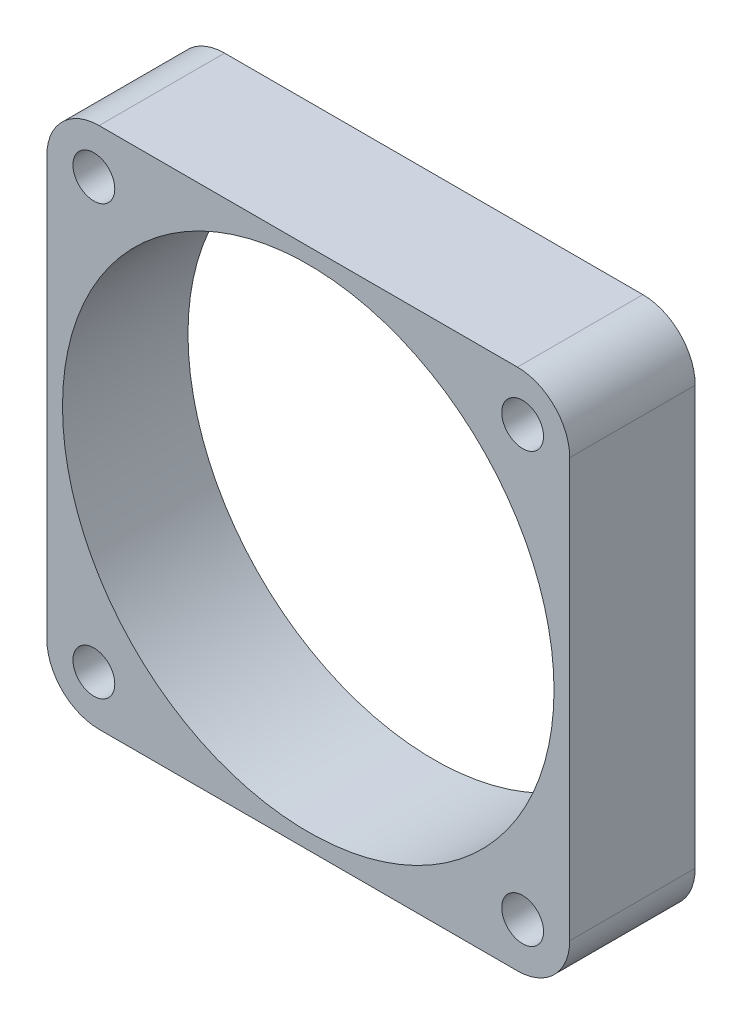
ISO-10303-21;
HEADER;
FILE_DESCRIPTION(('STEP AP214'),'2;1');
FILE_NAME('part.step','',(''),(''),'','','');
FILE_SCHEMA(('AUTOMOTIVE_DESIGN { 1 0 10303 214 1 1 1 1 }'));
ENDSEC;
DATA;
#1=APPLICATION_CONTEXT('core data for automotive mechanical design processes');
#2=APPLICATION_PROTOCOL_DEFINITION('international standard','automotive_design',2000,#1);
#3=PRODUCT_CONTEXT('',#1,'mechanical');
#4=PRODUCT('Part','Part','',(#3));
#5=PRODUCT_RELATED_PRODUCT_CATEGORY('part','',(#4));
#6=PRODUCT_DEFINITION_FORMATION('','',#4);
#7=PRODUCT_DEFINITION_CONTEXT('part definition',#1,'design');
#8=PRODUCT_DEFINITION('design','',#6,#7);
#9=PRODUCT_DEFINITION_SHAPE('','',#8);
#10=(LENGTH_UNIT() NAMED_UNIT(*) SI_UNIT(.MILLI.,.METRE.));
#11=(NAMED_UNIT(*) PLANE_ANGLE_UNIT() SI_UNIT($,.RADIAN.));
#12=(NAMED_UNIT(*) SI_UNIT($,.STERADIAN.) SOLID_ANGLE_UNIT());
#13=UNCERTAINTY_MEASURE_WITH_UNIT(LENGTH_MEASURE(1.E-05),#10,'distance_accuracy_value','');
#14=(GEOMETRIC_REPRESENTATION_CONTEXT(3) GLOBAL_UNCERTAINTY_ASSIGNED_CONTEXT((#13)) GLOBAL_UNIT_ASSIGNED_CONTEXT((#10,
#11,#12)) REPRESENTATION_CONTEXT('',''));
#15=CARTESIAN_POINT('',(0.,0.,0.));
#16=DIRECTION('',(0.,0.,1.));
#17=DIRECTION('',(1.,0.,0.));
#18=AXIS2_PLACEMENT_3D('',#15,#16,#17);
#19=CARTESIAN_POINT('',(0.,0.,12.));
#20=DIRECTION('',(0.,0.,1.));
#21=DIRECTION('',(1.,0.,0.));
#22=AXIS2_PLACEMENT_3D('',#19,#20,#21);
#23=PLANE('',#22);
#24=CARTESIAN_POINT('',(-46.7061885100436,1.63349551630329,12.));
#25=DIRECTION('',(0.,0.,1.));
#26=DIRECTION('',(1.,0.,0.));
#27=AXIS2_PLACEMENT_3D('',#24,#25,#26);
#28=CIRCLE('',#27,2.);
#29=CARTESIAN_POINT('',(-44.7061885100436,1.63349551630329,12.));
#30=VERTEX_POINT('',#29);
#31=EDGE_CURVE('E188',#30,#30,#28,.T.);
#32=ORIENTED_EDGE('',*,*,#31,.F.);
#33=EDGE_LOOP('',(#32));
#34=FACE_BOUND('',#33,.T.);
#35=CARTESIAN_POINT('',(-5.70618851004357,-39.3665044836967,12.));
#36=DIRECTION('',(0.,0.,1.));
#37=DIRECTION('',(1.,0.,0.));
#38=AXIS2_PLACEMENT_3D('',#35,#36,#37);
#39=CIRCLE('',#38,2.);
#40=CARTESIAN_POINT('',(-3.70618851004357,-39.3665044836967,12.));
#41=VERTEX_POINT('',#40);
#42=EDGE_CURVE('E177',#41,#41,#39,.T.);
#43=ORIENTED_EDGE('',*,*,#42,.F.);
#44=EDGE_LOOP('',(#43));
#45=FACE_BOUND('',#44,.T.);
#46=DIRECTION('',(0.,1.,0.));
#47=VECTOR('',#46,1.);
#48=CARTESIAN_POINT('',(-1.20618851004357,6.13349551630329,12.));
#49=LINE('',#48,#47);
#50=CARTESIAN_POINT('',(-1.20618851004357,-38.8665044836967,12.));
#51=VERTEX_POINT('',#50);
#52=CARTESIAN_POINT('',(-1.20618851004357,1.13349551630329,12.));
#53=VERTEX_POINT('',#52);
#54=EDGE_CURVE('E172',#51,#53,#49,.T.);
#55=ORIENTED_EDGE('',*,*,#54,.T.);
#56=CARTESIAN_POINT('',(-6.20618851004357,1.13349551630328,12.));
#57=DIRECTION('',(0.,0.,1.));
#58=DIRECTION('',(1.,0.,0.));
#59=AXIS2_PLACEMENT_3D('',#56,#57,#58);
#60=CIRCLE('',#59,5.);
#61=CARTESIAN_POINT('',(-6.20618851004357,6.13349551630329,12.));
#62=VERTEX_POINT('',#61);
#63=EDGE_CURVE('E149',#53,#62,#60,.T.);
#64=ORIENTED_EDGE('',*,*,#63,.T.);
#65=DIRECTION('',(-1.,0.,0.));
#66=VECTOR('',#65,1.);
#67=CARTESIAN_POINT('',(-51.2061885100436,6.13349551630329,12.));
#68=LINE('',#67,#66);
#69=CARTESIAN_POINT('',(-46.2061885100436,6.13349551630329,12.));
#70=VERTEX_POINT('',#69);
#71=EDGE_CURVE('E120',#62,#70,#68,.T.);
#72=ORIENTED_EDGE('',*,*,#71,.T.);
#73=CARTESIAN_POINT('',(-46.2061885100436,1.13349551630328,12.));
#74=DIRECTION('',(0.,0.,1.));
#75=DIRECTION('',(1.,0.,0.));
#76=AXIS2_PLACEMENT_3D('',#73,#74,#75);
#77=CIRCLE('',#76,5.);
#78=CARTESIAN_POINT('',(-51.2061885100436,1.13349551630328,12.));
#79=VERTEX_POINT('',#78);
#80=EDGE_CURVE('E147',#70,#79,#77,.T.);
#81=ORIENTED_EDGE('',*,*,#80,.T.);
#82=DIRECTION('',(0.,-1.,0.));
#83=VECTOR('',#82,1.);
#84=CARTESIAN_POINT('',(-51.2061885100436,6.13349551630329,12.));
#85=LINE('',#84,#83);
#86=CARTESIAN_POINT('',(-51.2061885100436,-38.8665044836967,12.));
#87=VERTEX_POINT('',#86);
#88=EDGE_CURVE('E127',#79,#87,#85,.T.);
#89=ORIENTED_EDGE('',*,*,#88,.T.);
#90=CARTESIAN_POINT('',(-46.2061885100436,-38.8665044836967,12.));
#91=DIRECTION('',(0.,0.,1.));
#92=DIRECTION('',(1.,0.,0.));
#93=AXIS2_PLACEMENT_3D('',#90,#91,#92);
#94=CIRCLE('',#93,5.);
#95=CARTESIAN_POINT('',(-46.2061885100436,-43.8665044836967,12.));
#96=VERTEX_POINT('',#95);
#97=EDGE_CURVE('E55',#87,#96,#94,.T.);
#98=ORIENTED_EDGE('',*,*,#97,.T.);
#99=DIRECTION('',(1.,0.,0.));
#100=VECTOR('',#99,1.);
#101=CARTESIAN_POINT('',(-51.2061885100436,-43.8665044836967,12.));
#102=LINE('',#101,#100);
#103=CARTESIAN_POINT('',(-6.20618851004357,-43.8665044836967,12.));
#104=VERTEX_POINT('',#103);
#105=EDGE_CURVE('E130',#96,#104,#102,.T.);
#106=ORIENTED_EDGE('',*,*,#105,.T.);
#107=CARTESIAN_POINT('',(-6.20618851004357,-38.8665044836967,12.));
#108=DIRECTION('',(0.,0.,1.));
#109=DIRECTION('',(1.,0.,0.));
#110=AXIS2_PLACEMENT_3D('',#107,#108,#109);
#111=CIRCLE('',#110,5.);
#112=EDGE_CURVE('E144',#104,#51,#111,.T.);
#113=ORIENTED_EDGE('',*,*,#112,.T.);
#114=EDGE_LOOP('',(#55,#64,#72,#81,#89,#98,#106,#113));
#115=FACE_BOUND('',#114,.T.);
#116=CARTESIAN_POINT('',(-46.7061885100436,-39.3665044836967,12.));
#117=DIRECTION('',(0.,0.,1.));
#118=DIRECTION('',(1.,0.,0.));
#119=AXIS2_PLACEMENT_3D('',#116,#117,#118);
#120=CIRCLE('',#119,2.);
#121=CARTESIAN_POINT('',(-44.7061885100436,-39.3665044836967,12.));
#122=VERTEX_POINT('',#121);
#123=EDGE_CURVE('E165',#122,#122,#120,.T.);
#124=ORIENTED_EDGE('',*,*,#123,.F.);
#125=EDGE_LOOP('',(#124));
#126=FACE_BOUND('',#125,.T.);
#127=CARTESIAN_POINT('',(-5.70618851004357,1.63349551630329,12.));
#128=DIRECTION('',(0.,0.,1.));
#129=DIRECTION('',(1.,0.,0.));
#130=AXIS2_PLACEMENT_3D('',#127,#128,#129);
#131=CIRCLE('',#130,2.);
#132=CARTESIAN_POINT('',(-3.70618851004357,1.63349551630329,12.));
#133=VERTEX_POINT('',#132);
#134=EDGE_CURVE('E182',#133,#133,#131,.T.);
#135=ORIENTED_EDGE('',*,*,#134,.F.);
#136=EDGE_LOOP('',(#135));
#137=FACE_BOUND('',#136,.T.);
#138=CARTESIAN_POINT('',(-26.2061885100436,-18.8665044836967,12.));
#139=DIRECTION('',(0.,0.,1.));
#140=DIRECTION('',(1.,0.,0.));
#141=AXIS2_PLACEMENT_3D('',#138,#139,#140);
#142=CIRCLE('',#141,23.5);
#143=CARTESIAN_POINT('',(-2.70618851004357,-18.8665044836967,12.));
#144=VERTEX_POINT('',#143);
#145=EDGE_CURVE('E194',#144,#144,#142,.T.);
#146=ORIENTED_EDGE('',*,*,#145,.F.);
#147=EDGE_LOOP('',(#146));
#148=FACE_BOUND('',#147,.T.);
#149=ADVANCED_FACE('F34',(#34,#45,#115,#126,#137,#148),#23,.T.);
#150=CARTESIAN_POINT('',(0.,0.,0.));
#151=DIRECTION('',(0.,0.,1.));
#152=DIRECTION('',(1.,0.,0.));
#153=AXIS2_PLACEMENT_3D('',#150,#151,#152);
#154=PLANE('',#153);
#155=DIRECTION('',(-1.,0.,0.));
#156=VECTOR('',#155,1.);
#157=CARTESIAN_POINT('',(-51.2061885100436,6.13349551630329,0.));
#158=LINE('',#157,#156);
#159=CARTESIAN_POINT('',(-6.20618851004357,6.13349551630329,0.));
#160=VERTEX_POINT('',#159);
#161=CARTESIAN_POINT('',(-46.2061885100436,6.13349551630329,0.));
#162=VERTEX_POINT('',#161);
#163=EDGE_CURVE('E117',#160,#162,#158,.T.);
#164=ORIENTED_EDGE('',*,*,#163,.F.);
#165=CARTESIAN_POINT('',(-6.20618851004357,1.13349551630328,0.));
#166=DIRECTION('',(0.,0.,1.));
#167=DIRECTION('',(1.,0.,0.));
#168=AXIS2_PLACEMENT_3D('',#165,#166,#167);
#169=CIRCLE('',#168,5.);
#170=CARTESIAN_POINT('',(-1.20618851004357,1.13349551630329,0.));
#171=VERTEX_POINT('',#170);
#172=EDGE_CURVE('E100',#160,#171,#169,.F.);
#173=ORIENTED_EDGE('',*,*,#172,.T.);
#174=DIRECTION('',(0.,1.,0.));
#175=VECTOR('',#174,1.);
#176=CARTESIAN_POINT('',(-1.20618851004357,6.13349551630329,0.));
#177=LINE('',#176,#175);
#178=CARTESIAN_POINT('',(-1.20618851004357,-38.8665044836967,0.));
#179=VERTEX_POINT('',#178);
#180=EDGE_CURVE('E128',#179,#171,#177,.T.);
#181=ORIENTED_EDGE('',*,*,#180,.F.);
#182=CARTESIAN_POINT('',(-6.20618851004357,-38.8665044836967,0.));
#183=DIRECTION('',(0.,0.,1.));
#184=DIRECTION('',(1.,0.,0.));
#185=AXIS2_PLACEMENT_3D('',#182,#183,#184);
#186=CIRCLE('',#185,5.);
#187=CARTESIAN_POINT('',(-6.20618851004357,-43.8665044836967,0.));
#188=VERTEX_POINT('',#187);
#189=EDGE_CURVE('E121',#179,#188,#186,.F.);
#190=ORIENTED_EDGE('',*,*,#189,.T.);
#191=DIRECTION('',(1.,0.,0.));
#192=VECTOR('',#191,1.);
#193=CARTESIAN_POINT('',(-51.2061885100436,-43.8665044836967,0.));
#194=LINE('',#193,#192);
#195=CARTESIAN_POINT('',(-46.2061885100436,-43.8665044836967,0.));
#196=VERTEX_POINT('',#195);
#197=EDGE_CURVE('E132',#196,#188,#194,.T.);
#198=ORIENTED_EDGE('',*,*,#197,.F.);
#199=CARTESIAN_POINT('',(-46.2061885100436,-38.8665044836967,0.));
#200=DIRECTION('',(0.,0.,1.));
#201=DIRECTION('',(1.,0.,0.));
#202=AXIS2_PLACEMENT_3D('',#199,#200,#201);
#203=CIRCLE('',#202,5.);
#204=CARTESIAN_POINT('',(-51.2061885100436,-38.8665044836967,0.));
#205=VERTEX_POINT('',#204);
#206=EDGE_CURVE('E138',#196,#205,#203,.F.);
#207=ORIENTED_EDGE('',*,*,#206,.T.);
#208=DIRECTION('',(0.,-1.,0.));
#209=VECTOR('',#208,1.);
#210=CARTESIAN_POINT('',(-51.2061885100436,6.13349551630329,0.));
#211=LINE('',#210,#209);
#212=CARTESIAN_POINT('',(-51.2061885100436,1.13349551630328,0.));
#213=VERTEX_POINT('',#212);
#214=EDGE_CURVE('E160',#213,#205,#211,.T.);
#215=ORIENTED_EDGE('',*,*,#214,.F.);
#216=CARTESIAN_POINT('',(-46.2061885100436,1.13349551630328,0.));
#217=DIRECTION('',(0.,0.,1.));
#218=DIRECTION('',(1.,0.,0.));
#219=AXIS2_PLACEMENT_3D('',#216,#217,#218);
#220=CIRCLE('',#219,5.);
#221=EDGE_CURVE('E111',#213,#162,#220,.F.);
#222=ORIENTED_EDGE('',*,*,#221,.T.);
#223=EDGE_LOOP('',(#164,#173,#181,#190,#198,#207,#215,#222));
#224=FACE_BOUND('',#223,.T.);
#225=CARTESIAN_POINT('',(-46.7061885100436,-39.3665044836967,0.));
#226=DIRECTION('',(0.,0.,1.));
#227=DIRECTION('',(1.,0.,0.));
#228=AXIS2_PLACEMENT_3D('',#225,#226,#227);
#229=CIRCLE('',#228,2.);
#230=CARTESIAN_POINT('',(-44.7061885100436,-39.3665044836967,0.));
#231=VERTEX_POINT('',#230);
#232=EDGE_CURVE('E168',#231,#231,#229,.T.);
#233=ORIENTED_EDGE('',*,*,#232,.T.);
#234=EDGE_LOOP('',(#233));
#235=FACE_BOUND('',#234,.T.);
#236=CARTESIAN_POINT('',(-5.70618851004357,-39.3665044836967,0.));
#237=DIRECTION('',(0.,0.,1.));
#238=DIRECTION('',(1.,0.,0.));
#239=AXIS2_PLACEMENT_3D('',#236,#237,#238);
#240=CIRCLE('',#239,2.);
#241=CARTESIAN_POINT('',(-3.70618851004357,-39.3665044836967,0.));
#242=VERTEX_POINT('',#241);
#243=EDGE_CURVE('E179',#242,#242,#240,.T.);
#244=ORIENTED_EDGE('',*,*,#243,.T.);
#245=EDGE_LOOP('',(#244));
#246=FACE_BOUND('',#245,.T.);
#247=CARTESIAN_POINT('',(-5.70618851004357,1.63349551630329,0.));
#248=DIRECTION('',(0.,0.,1.));
#249=DIRECTION('',(1.,0.,0.));
#250=AXIS2_PLACEMENT_3D('',#247,#248,#249);
#251=CIRCLE('',#250,2.);
#252=CARTESIAN_POINT('',(-3.70618851004357,1.63349551630329,0.));
#253=VERTEX_POINT('',#252);
#254=EDGE_CURVE('E185',#253,#253,#251,.T.);
#255=ORIENTED_EDGE('',*,*,#254,.T.);
#256=EDGE_LOOP('',(#255));
#257=FACE_BOUND('',#256,.T.);
#258=CARTESIAN_POINT('',(-46.7061885100436,1.63349551630329,0.));
#259=DIRECTION('',(0.,0.,1.));
#260=DIRECTION('',(1.,0.,0.));
#261=AXIS2_PLACEMENT_3D('',#258,#259,#260);
#262=CIRCLE('',#261,2.);
#263=CARTESIAN_POINT('',(-44.7061885100436,1.63349551630329,0.));
#264=VERTEX_POINT('',#263);
#265=EDGE_CURVE('E191',#264,#264,#262,.T.);
#266=ORIENTED_EDGE('',*,*,#265,.T.);
#267=EDGE_LOOP('',(#266));
#268=FACE_BOUND('',#267,.T.);
#269=CARTESIAN_POINT('',(-26.2061885100436,-18.8665044836967,0.));
#270=DIRECTION('',(0.,0.,1.));
#271=DIRECTION('',(1.,0.,0.));
#272=AXIS2_PLACEMENT_3D('',#269,#270,#271);
#273=CIRCLE('',#272,23.5);
#274=CARTESIAN_POINT('',(-2.70618851004357,-18.8665044836967,0.));
#275=VERTEX_POINT('',#274);
#276=EDGE_CURVE('E197',#275,#275,#273,.T.);
#277=ORIENTED_EDGE('',*,*,#276,.T.);
#278=EDGE_LOOP('',(#277));
#279=FACE_BOUND('',#278,.T.);
#280=ADVANCED_FACE('F124',(#224,#235,#246,#257,#268,#279),#154,.F.);
#281=CARTESIAN_POINT('',(-51.2061885100436,6.13349551630329,12.));
#282=DIRECTION('',(1.,0.,0.));
#283=DIRECTION('',(0.,1.,0.));
#284=AXIS2_PLACEMENT_3D('',#281,#282,#283);
#285=PLANE('',#284);
#286=ORIENTED_EDGE('',*,*,#88,.F.);
#287=DIRECTION('',(0.,0.,-1.));
#288=VECTOR('',#287,1.);
#289=CARTESIAN_POINT('',(-51.2061885100436,1.13349551630328,12.));
#290=LINE('',#289,#288);
#291=EDGE_CURVE('E153',#79,#213,#290,.T.);
#292=ORIENTED_EDGE('',*,*,#291,.T.);
#293=ORIENTED_EDGE('',*,*,#214,.T.);
#294=DIRECTION('',(0.,0.,-1.));
#295=VECTOR('',#294,1.);
#296=CARTESIAN_POINT('',(-51.2061885100436,-38.8665044836967,12.));
#297=LINE('',#296,#295);
#298=EDGE_CURVE('E151',#205,#87,#297,.F.);
#299=ORIENTED_EDGE('',*,*,#298,.T.);
#300=EDGE_LOOP('',(#286,#292,#293,#299));
#301=FACE_BOUND('',#300,.T.);
#302=ADVANCED_FACE('F159',(#301),#285,.F.);
#303=CARTESIAN_POINT('',(-51.2061885100436,-43.8665044836967,12.));
#304=DIRECTION('',(0.,1.,0.));
#305=DIRECTION('',(0.,0.,1.));
#306=AXIS2_PLACEMENT_3D('',#303,#304,#305);
#307=PLANE('',#306);
#308=ORIENTED_EDGE('',*,*,#105,.F.);
#309=DIRECTION('',(0.,0.,-1.));
#310=VECTOR('',#309,1.);
#311=CARTESIAN_POINT('',(-46.2061885100436,-43.8665044836967,12.));
#312=LINE('',#311,#310);
#313=EDGE_CURVE('E11',#96,#196,#312,.T.);
#314=ORIENTED_EDGE('',*,*,#313,.T.);
#315=ORIENTED_EDGE('',*,*,#197,.T.);
#316=DIRECTION('',(0.,0.,-1.));
#317=VECTOR('',#316,1.);
#318=CARTESIAN_POINT('',(-6.20618851004357,-43.8665044836967,12.));
#319=LINE('',#318,#317);
#320=EDGE_CURVE('E42',#188,#104,#319,.F.);
#321=ORIENTED_EDGE('',*,*,#320,.T.);
#322=EDGE_LOOP('',(#308,#314,#315,#321));
#323=FACE_BOUND('',#322,.T.);
#324=ADVANCED_FACE('F224',(#323),#307,.F.);
#325=CARTESIAN_POINT('',(-1.20618851004357,6.13349551630329,12.));
#326=DIRECTION('',(-1.,0.,0.));
#327=DIRECTION('',(0.,-1.,0.));
#328=AXIS2_PLACEMENT_3D('',#325,#326,#327);
#329=PLANE('',#328);
#330=ORIENTED_EDGE('',*,*,#180,.T.);
#331=DIRECTION('',(0.,0.,-1.));
#332=VECTOR('',#331,1.);
#333=CARTESIAN_POINT('',(-1.20618851004357,1.13349551630329,12.));
#334=LINE('',#333,#332);
#335=EDGE_CURVE('E105',#171,#53,#334,.F.);
#336=ORIENTED_EDGE('',*,*,#335,.T.);
#337=ORIENTED_EDGE('',*,*,#54,.F.);
#338=DIRECTION('',(0.,0.,-1.));
#339=VECTOR('',#338,1.);
#340=CARTESIAN_POINT('',(-1.20618851004357,-38.8665044836967,12.));
#341=LINE('',#340,#339);
#342=EDGE_CURVE('E110',#51,#179,#341,.T.);
#343=ORIENTED_EDGE('',*,*,#342,.T.);
#344=EDGE_LOOP('',(#330,#336,#337,#343));
#345=FACE_BOUND('',#344,.T.);
#346=ADVANCED_FACE('F221',(#345),#329,.F.);
#347=CARTESIAN_POINT('',(-51.2061885100436,6.13349551630329,12.));
#348=DIRECTION('',(0.,-1.,0.));
#349=DIRECTION('',(0.,0.,-1.));
#350=AXIS2_PLACEMENT_3D('',#347,#348,#349);
#351=PLANE('',#350);
#352=ORIENTED_EDGE('',*,*,#71,.F.);
#353=DIRECTION('',(0.,0.,-1.));
#354=VECTOR('',#353,1.);
#355=CARTESIAN_POINT('',(-6.20618851004357,6.13349551630329,12.));
#356=LINE('',#355,#354);
#357=EDGE_CURVE('E104',#62,#160,#356,.T.);
#358=ORIENTED_EDGE('',*,*,#357,.T.);
#359=ORIENTED_EDGE('',*,*,#163,.T.);
#360=DIRECTION('',(0.,0.,-1.));
#361=VECTOR('',#360,1.);
#362=CARTESIAN_POINT('',(-46.2061885100436,6.13349551630329,12.));
#363=LINE('',#362,#361);
#364=EDGE_CURVE('E122',#162,#70,#363,.F.);
#365=ORIENTED_EDGE('',*,*,#364,.T.);
#366=EDGE_LOOP('',(#352,#358,#359,#365));
#367=FACE_BOUND('',#366,.T.);
#368=ADVANCED_FACE('F116',(#367),#351,.F.);
#369=CARTESIAN_POINT('',(-46.7061885100436,-39.3665044836967,12.));
#370=DIRECTION('',(0.,0.,-1.));
#371=DIRECTION('',(-1.,0.,0.));
#372=AXIS2_PLACEMENT_3D('',#369,#370,#371);
#373=CYLINDRICAL_SURFACE('',#372,2.);
#374=ORIENTED_EDGE('',*,*,#123,.T.);
#375=EDGE_LOOP('',(#374));
#376=FACE_BOUND('',#375,.T.);
#377=ORIENTED_EDGE('',*,*,#232,.F.);
#378=EDGE_LOOP('',(#377));
#379=FACE_BOUND('',#378,.T.);
#380=ADVANCED_FACE('F216',(#376,#379),#373,.F.);
#381=CARTESIAN_POINT('',(-5.70618851004357,-39.3665044836967,12.));
#382=DIRECTION('',(0.,0.,-1.));
#383=DIRECTION('',(-1.,0.,0.));
#384=AXIS2_PLACEMENT_3D('',#381,#382,#383);
#385=CYLINDRICAL_SURFACE('',#384,2.);
#386=ORIENTED_EDGE('',*,*,#42,.T.);
#387=EDGE_LOOP('',(#386));
#388=FACE_BOUND('',#387,.T.);
#389=ORIENTED_EDGE('',*,*,#243,.F.);
#390=EDGE_LOOP('',(#389));
#391=FACE_BOUND('',#390,.T.);
#392=ADVANCED_FACE('F254',(#388,#391),#385,.F.);
#393=CARTESIAN_POINT('',(-5.70618851004357,1.63349551630329,12.));
#394=DIRECTION('',(0.,0.,-1.));
#395=DIRECTION('',(-1.,0.,0.));
#396=AXIS2_PLACEMENT_3D('',#393,#394,#395);
#397=CYLINDRICAL_SURFACE('',#396,2.);
#398=ORIENTED_EDGE('',*,*,#134,.T.);
#399=EDGE_LOOP('',(#398));
#400=FACE_BOUND('',#399,.T.);
#401=ORIENTED_EDGE('',*,*,#254,.F.);
#402=EDGE_LOOP('',(#401));
#403=FACE_BOUND('',#402,.T.);
#404=ADVANCED_FACE('F250',(#400,#403),#397,.F.);
#405=CARTESIAN_POINT('',(-46.7061885100436,1.63349551630329,12.));
#406=DIRECTION('',(0.,0.,-1.));
#407=DIRECTION('',(-1.,0.,0.));
#408=AXIS2_PLACEMENT_3D('',#405,#406,#407);
#409=CYLINDRICAL_SURFACE('',#408,2.);
#410=ORIENTED_EDGE('',*,*,#31,.T.);
#411=EDGE_LOOP('',(#410));
#412=FACE_BOUND('',#411,.T.);
#413=ORIENTED_EDGE('',*,*,#265,.F.);
#414=EDGE_LOOP('',(#413));
#415=FACE_BOUND('',#414,.T.);
#416=ADVANCED_FACE('F253',(#412,#415),#409,.F.);
#417=CARTESIAN_POINT('',(-26.2061885100436,-18.8665044836967,12.));
#418=DIRECTION('',(0.,0.,-1.));
#419=DIRECTION('',(-1.,0.,0.));
#420=AXIS2_PLACEMENT_3D('',#417,#418,#419);
#421=CYLINDRICAL_SURFACE('',#420,23.5);
#422=ORIENTED_EDGE('',*,*,#145,.T.);
#423=EDGE_LOOP('',(#422));
#424=FACE_BOUND('',#423,.T.);
#425=ORIENTED_EDGE('',*,*,#276,.F.);
#426=EDGE_LOOP('',(#425));
#427=FACE_BOUND('',#426,.T.);
#428=ADVANCED_FACE('F203',(#424,#427),#421,.F.);
#429=CARTESIAN_POINT('',(-6.20618851004357,1.13349551630328,12.));
#430=DIRECTION('',(0.,0.,-1.));
#431=DIRECTION('',(-1.,0.,0.));
#432=AXIS2_PLACEMENT_3D('',#429,#430,#431);
#433=CYLINDRICAL_SURFACE('',#432,5.);
#434=ORIENTED_EDGE('',*,*,#63,.F.);
#435=ORIENTED_EDGE('',*,*,#335,.F.);
#436=ORIENTED_EDGE('',*,*,#172,.F.);
#437=ORIENTED_EDGE('',*,*,#357,.F.);
#438=EDGE_LOOP('',(#434,#435,#436,#437));
#439=FACE_BOUND('',#438,.T.);
#440=ADVANCED_FACE('F103',(#439),#433,.T.);
#441=CARTESIAN_POINT('',(-46.2061885100436,1.13349551630328,12.));
#442=DIRECTION('',(0.,0.,-1.));
#443=DIRECTION('',(-1.,0.,0.));
#444=AXIS2_PLACEMENT_3D('',#441,#442,#443);
#445=CYLINDRICAL_SURFACE('',#444,5.);
#446=ORIENTED_EDGE('',*,*,#80,.F.);
#447=ORIENTED_EDGE('',*,*,#364,.F.);
#448=ORIENTED_EDGE('',*,*,#221,.F.);
#449=ORIENTED_EDGE('',*,*,#291,.F.);
#450=EDGE_LOOP('',(#446,#447,#448,#449));
#451=FACE_BOUND('',#450,.T.);
#452=ADVANCED_FACE('F232',(#451),#445,.T.);
#453=CARTESIAN_POINT('',(-46.2061885100436,-38.8665044836967,12.));
#454=DIRECTION('',(0.,0.,-1.));
#455=DIRECTION('',(-1.,0.,0.));
#456=AXIS2_PLACEMENT_3D('',#453,#454,#455);
#457=CYLINDRICAL_SURFACE('',#456,5.);
#458=ORIENTED_EDGE('',*,*,#97,.F.);
#459=ORIENTED_EDGE('',*,*,#298,.F.);
#460=ORIENTED_EDGE('',*,*,#206,.F.);
#461=ORIENTED_EDGE('',*,*,#313,.F.);
#462=EDGE_LOOP('',(#458,#459,#460,#461));
#463=FACE_BOUND('',#462,.T.);
#464=ADVANCED_FACE('F234',(#463),#457,.T.);
#465=CARTESIAN_POINT('',(-6.20618851004357,-38.8665044836967,12.));
#466=DIRECTION('',(0.,0.,-1.));
#467=DIRECTION('',(-1.,0.,0.));
#468=AXIS2_PLACEMENT_3D('',#465,#466,#467);
#469=CYLINDRICAL_SURFACE('',#468,5.);
#470=ORIENTED_EDGE('',*,*,#112,.F.);
#471=ORIENTED_EDGE('',*,*,#320,.F.);
#472=ORIENTED_EDGE('',*,*,#189,.F.);
#473=ORIENTED_EDGE('',*,*,#342,.F.);
#474=EDGE_LOOP('',(#470,#471,#472,#473));
#475=FACE_BOUND('',#474,.T.);
#476=ADVANCED_FACE('F36',(#475),#469,.T.);
#477=CLOSED_SHELL('',(#149,#280,#302,#324,#346,#368,#380,#392,#404,#416,#428,#440,#452,#464,#476));
#478=MANIFOLD_SOLID_BREP('B2',#477);
#479=ADVANCED_BREP_SHAPE_REPRESENTATION('',(#18,#478),#14);
#480=SHAPE_DEFINITION_REPRESENTATION(#9,#479);
ENDSEC;
END-ISO-10303-21;
